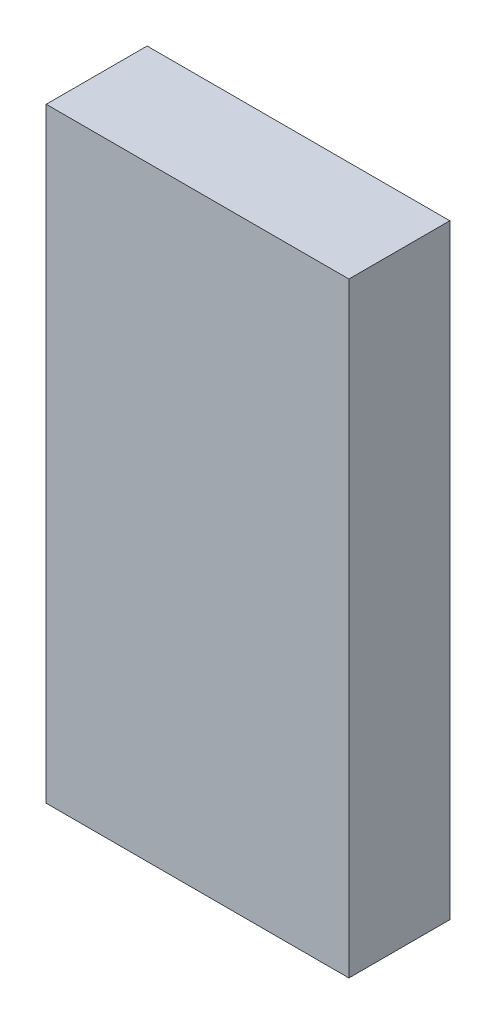
ISO-10303-21;
HEADER;
FILE_DESCRIPTION(('STEP AP214'),'2;1');
FILE_NAME('part.step','',(''),(''),'','','');
FILE_SCHEMA(('AUTOMOTIVE_DESIGN { 1 0 10303 214 1 1 1 1 }'));
ENDSEC;
DATA;
#1=APPLICATION_CONTEXT('core data for automotive mechanical design processes');
#2=APPLICATION_PROTOCOL_DEFINITION('international standard','automotive_design',2000,#1);
#3=PRODUCT_CONTEXT('',#1,'mechanical');
#4=PRODUCT('Part','Part','',(#3));
#5=PRODUCT_RELATED_PRODUCT_CATEGORY('part','',(#4));
#6=PRODUCT_DEFINITION_FORMATION('','',#4);
#7=PRODUCT_DEFINITION_CONTEXT('part definition',#1,'design');
#8=PRODUCT_DEFINITION('design','',#6,#7);
#9=PRODUCT_DEFINITION_SHAPE('','',#8);
#10=(LENGTH_UNIT() NAMED_UNIT(*) SI_UNIT(.MILLI.,.METRE.));
#11=(NAMED_UNIT(*) PLANE_ANGLE_UNIT() SI_UNIT($,.RADIAN.));
#12=(NAMED_UNIT(*) SI_UNIT($,.STERADIAN.) SOLID_ANGLE_UNIT());
#13=UNCERTAINTY_MEASURE_WITH_UNIT(LENGTH_MEASURE(1.E-05),#10,'distance_accuracy_value','');
#14=(GEOMETRIC_REPRESENTATION_CONTEXT(3) GLOBAL_UNCERTAINTY_ASSIGNED_CONTEXT((#13)) GLOBAL_UNIT_ASSIGNED_CONTEXT((#10,
#11,#12)) REPRESENTATION_CONTEXT('',''));
#15=CARTESIAN_POINT('',(0.,0.,0.));
#16=DIRECTION('',(0.,0.,1.));
#17=DIRECTION('',(1.,0.,0.));
#18=AXIS2_PLACEMENT_3D('',#15,#16,#17);
#19=CARTESIAN_POINT('',(0.,0.,-12.7));
#20=DIRECTION('',(1.,0.,0.));
#21=DIRECTION('',(0.,1.,0.));
#22=AXIS2_PLACEMENT_3D('',#19,#20,#21);
#23=PLANE('',#22);
#24=DIRECTION('',(0.,1.,0.));
#25=VECTOR('',#24,1.);
#26=CARTESIAN_POINT('',(0.,0.,0.));
#27=LINE('',#26,#25);
#28=CARTESIAN_POINT('',(0.,-76.2,0.));
#29=VERTEX_POINT('',#28);
#30=CARTESIAN_POINT('',(0.,0.,0.));
#31=VERTEX_POINT('',#30);
#32=EDGE_CURVE('E97',#29,#31,#27,.T.);
#33=ORIENTED_EDGE('',*,*,#32,.F.);
#34=DIRECTION('',(0.,0.,1.));
#35=VECTOR('',#34,1.);
#36=CARTESIAN_POINT('',(0.,-76.2,-12.7));
#37=LINE('',#36,#35);
#38=CARTESIAN_POINT('',(0.,-76.2,-12.7));
#39=VERTEX_POINT('',#38);
#40=EDGE_CURVE('E11',#39,#29,#37,.T.);
#41=ORIENTED_EDGE('',*,*,#40,.F.);
#42=DIRECTION('',(0.,1.,0.));
#43=VECTOR('',#42,1.);
#44=CARTESIAN_POINT('',(0.,0.,-12.7));
#45=LINE('',#44,#43);
#46=CARTESIAN_POINT('',(0.,0.,-12.7));
#47=VERTEX_POINT('',#46);
#48=EDGE_CURVE('E91',#39,#47,#45,.T.);
#49=ORIENTED_EDGE('',*,*,#48,.T.);
#50=DIRECTION('',(0.,0.,1.));
#51=VECTOR('',#50,1.);
#52=CARTESIAN_POINT('',(0.,0.,-12.7));
#53=LINE('',#52,#51);
#54=EDGE_CURVE('E36',#47,#31,#53,.T.);
#55=ORIENTED_EDGE('',*,*,#54,.T.);
#56=EDGE_LOOP('',(#33,#41,#49,#55));
#57=FACE_BOUND('',#56,.T.);
#58=ADVANCED_FACE('F33',(#57),#23,.T.);
#59=CARTESIAN_POINT('',(0.,-76.2,-12.7));
#60=DIRECTION('',(0.,-1.,0.));
#61=DIRECTION('',(1.,0.,0.));
#62=AXIS2_PLACEMENT_3D('',#59,#60,#61);
#63=PLANE('',#62);
#64=DIRECTION('',(1.,0.,0.));
#65=VECTOR('',#64,1.);
#66=CARTESIAN_POINT('',(0.,-76.2,0.));
#67=LINE('',#66,#65);
#68=CARTESIAN_POINT('',(-38.1,-76.2,0.));
#69=VERTEX_POINT('',#68);
#70=EDGE_CURVE('E93',#69,#29,#67,.T.);
#71=ORIENTED_EDGE('',*,*,#70,.F.);
#72=DIRECTION('',(0.,0.,1.));
#73=VECTOR('',#72,1.);
#74=CARTESIAN_POINT('',(-38.1,-76.2,-12.7));
#75=LINE('',#74,#73);
#76=CARTESIAN_POINT('',(-38.1,-76.2,-12.7));
#77=VERTEX_POINT('',#76);
#78=EDGE_CURVE('E42',#77,#69,#75,.T.);
#79=ORIENTED_EDGE('',*,*,#78,.F.);
#80=DIRECTION('',(1.,0.,0.));
#81=VECTOR('',#80,1.);
#82=CARTESIAN_POINT('',(0.,-76.2,-12.7));
#83=LINE('',#82,#81);
#84=EDGE_CURVE('E88',#77,#39,#83,.T.);
#85=ORIENTED_EDGE('',*,*,#84,.T.);
#86=ORIENTED_EDGE('',*,*,#40,.T.);
#87=EDGE_LOOP('',(#71,#79,#85,#86));
#88=FACE_BOUND('',#87,.T.);
#89=ADVANCED_FACE('F107',(#88),#63,.T.);
#90=CARTESIAN_POINT('',(-38.1,0.,-12.7));
#91=DIRECTION('',(-1.,0.,0.));
#92=DIRECTION('',(0.,-1.,0.));
#93=AXIS2_PLACEMENT_3D('',#90,#91,#92);
#94=PLANE('',#93);
#95=DIRECTION('',(0.,-1.,0.));
#96=VECTOR('',#95,1.);
#97=CARTESIAN_POINT('',(-38.1,0.,0.));
#98=LINE('',#97,#96);
#99=CARTESIAN_POINT('',(-38.1,0.,0.));
#100=VERTEX_POINT('',#99);
#101=EDGE_CURVE('E83',#100,#69,#98,.T.);
#102=ORIENTED_EDGE('',*,*,#101,.F.);
#103=DIRECTION('',(0.,0.,1.));
#104=VECTOR('',#103,1.);
#105=CARTESIAN_POINT('',(-38.1,0.,-12.7));
#106=LINE('',#105,#104);
#107=CARTESIAN_POINT('',(-38.1,0.,-12.7));
#108=VERTEX_POINT('',#107);
#109=EDGE_CURVE('E78',#108,#100,#106,.T.);
#110=ORIENTED_EDGE('',*,*,#109,.F.);
#111=DIRECTION('',(0.,-1.,0.));
#112=VECTOR('',#111,1.);
#113=CARTESIAN_POINT('',(-38.1,0.,-12.7));
#114=LINE('',#113,#112);
#115=EDGE_CURVE('E81',#108,#77,#114,.T.);
#116=ORIENTED_EDGE('',*,*,#115,.T.);
#117=ORIENTED_EDGE('',*,*,#78,.T.);
#118=EDGE_LOOP('',(#102,#110,#116,#117));
#119=FACE_BOUND('',#118,.T.);
#120=ADVANCED_FACE('F80',(#119),#94,.T.);
#121=CARTESIAN_POINT('',(0.,0.,-12.7));
#122=DIRECTION('',(0.,1.,0.));
#123=DIRECTION('',(-1.,0.,0.));
#124=AXIS2_PLACEMENT_3D('',#121,#122,#123);
#125=PLANE('',#124);
#126=DIRECTION('',(-1.,0.,0.));
#127=VECTOR('',#126,1.);
#128=CARTESIAN_POINT('',(0.,0.,0.));
#129=LINE('',#128,#127);
#130=EDGE_CURVE('E100',#31,#100,#129,.T.);
#131=ORIENTED_EDGE('',*,*,#130,.F.);
#132=ORIENTED_EDGE('',*,*,#54,.F.);
#133=DIRECTION('',(-1.,0.,0.));
#134=VECTOR('',#133,1.);
#135=CARTESIAN_POINT('',(0.,0.,-12.7));
#136=LINE('',#135,#134);
#137=EDGE_CURVE('E87',#47,#108,#136,.T.);
#138=ORIENTED_EDGE('',*,*,#137,.T.);
#139=ORIENTED_EDGE('',*,*,#109,.T.);
#140=EDGE_LOOP('',(#131,#132,#138,#139));
#141=FACE_BOUND('',#140,.T.);
#142=ADVANCED_FACE('F90',(#141),#125,.T.);
#143=CARTESIAN_POINT('',(0.,0.,-12.7));
#144=DIRECTION('',(0.,0.,-1.));
#145=DIRECTION('',(-1.,0.,0.));
#146=AXIS2_PLACEMENT_3D('',#143,#144,#145);
#147=PLANE('',#146);
#148=ORIENTED_EDGE('',*,*,#48,.F.);
#149=ORIENTED_EDGE('',*,*,#84,.F.);
#150=ORIENTED_EDGE('',*,*,#115,.F.);
#151=ORIENTED_EDGE('',*,*,#137,.F.);
#152=EDGE_LOOP('',(#148,#149,#150,#151));
#153=FACE_BOUND('',#152,.T.);
#154=ADVANCED_FACE('F86',(#153),#147,.T.);
#155=CARTESIAN_POINT('',(0.,0.,0.));
#156=DIRECTION('',(0.,0.,-1.));
#157=DIRECTION('',(-1.,0.,0.));
#158=AXIS2_PLACEMENT_3D('',#155,#156,#157);
#159=PLANE('',#158);
#160=ORIENTED_EDGE('',*,*,#32,.T.);
#161=ORIENTED_EDGE('',*,*,#130,.T.);
#162=ORIENTED_EDGE('',*,*,#101,.T.);
#163=ORIENTED_EDGE('',*,*,#70,.T.);
#164=EDGE_LOOP('',(#160,#161,#162,#163));
#165=FACE_BOUND('',#164,.T.);
#166=ADVANCED_FACE('F106',(#165),#159,.F.);
#167=CLOSED_SHELL('',(#58,#89,#120,#142,#154,#166));
#168=MANIFOLD_SOLID_BREP('B2',#167);
#169=ADVANCED_BREP_SHAPE_REPRESENTATION('',(#18,#168),#14);
#170=SHAPE_DEFINITION_REPRESENTATION(#9,#169);
ENDSEC;
END-ISO-10303-21;
